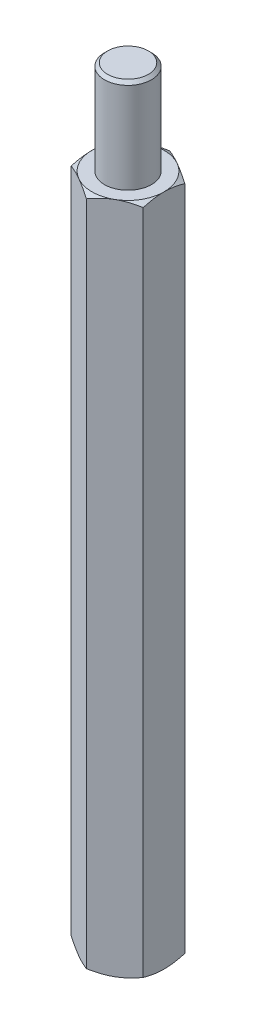
ISO-10303-21;
HEADER;
FILE_DESCRIPTION(('STEP AP214'),'2;1');
FILE_NAME('part.step','',(''),(''),'','','');
FILE_SCHEMA(('AUTOMOTIVE_DESIGN { 1 0 10303 214 1 1 1 1 }'));
ENDSEC;
DATA;
#1=APPLICATION_CONTEXT('core data for automotive mechanical design processes');
#2=APPLICATION_PROTOCOL_DEFINITION('international standard','automotive_design',2000,#1);
#3=PRODUCT_CONTEXT('',#1,'mechanical');
#4=PRODUCT('Part','Part','',(#3));
#5=PRODUCT_RELATED_PRODUCT_CATEGORY('part','',(#4));
#6=PRODUCT_DEFINITION_FORMATION('','',#4);
#7=PRODUCT_DEFINITION_CONTEXT('part definition',#1,'design');
#8=PRODUCT_DEFINITION('design','',#6,#7);
#9=PRODUCT_DEFINITION_SHAPE('','',#8);
#10=(LENGTH_UNIT() NAMED_UNIT(*) SI_UNIT(.MILLI.,.METRE.));
#11=(NAMED_UNIT(*) PLANE_ANGLE_UNIT() SI_UNIT($,.RADIAN.));
#12=(NAMED_UNIT(*) SI_UNIT($,.STERADIAN.) SOLID_ANGLE_UNIT());
#13=UNCERTAINTY_MEASURE_WITH_UNIT(LENGTH_MEASURE(1.E-05),#10,'distance_accuracy_value','');
#14=(GEOMETRIC_REPRESENTATION_CONTEXT(3) GLOBAL_UNCERTAINTY_ASSIGNED_CONTEXT((#13)) GLOBAL_UNIT_ASSIGNED_CONTEXT((#10,
#11,#12)) REPRESENTATION_CONTEXT('',''));
#15=CARTESIAN_POINT('',(0.,0.,0.));
#16=DIRECTION('',(0.,0.,1.));
#17=DIRECTION('',(1.,0.,0.));
#18=AXIS2_PLACEMENT_3D('',#15,#16,#17);
#19=CARTESIAN_POINT('',(2.3,43.,-1.32790561913614));
#20=DIRECTION('',(-0.5,0.,0.866025403784439));
#21=DIRECTION('',(0.866025403784439,0.,0.5));
#22=AXIS2_PLACEMENT_3D('',#19,#20,#21);
#23=PLANE('',#22);
#24=CARTESIAN_POINT('',(2.3002,42.7945056147885,-1.3277901490823));
#25=CARTESIAN_POINT('',(2.19912555400197,42.828211213548,-1.38614550768746));
#26=CARTESIAN_POINT('',(2.09717864227825,42.8588655278825,-1.4450045846142));
#27=CARTESIAN_POINT('',(1.89151940113185,42.9123736323119,-1.5637420028514));
#28=CARTESIAN_POINT('',(1.78780341669388,42.9352084920134,-1.62362245438593));
#29=CARTESIAN_POINT('',(1.58165684938662,42.9707552235812,-1.7426412305133));
#30=CARTESIAN_POINT('',(1.47925798966799,42.983703661704,-1.80176123973656));
#31=CARTESIAN_POINT('',(1.27397830442753,42.9991630436033,-1.9202795212693));
#32=CARTESIAN_POINT('',(1.1710982253342,43.0016867873477,-1.97967736262809));
#33=CARTESIAN_POINT('',(0.978851473271728,42.9964441482942,-2.09067107668218));
#34=CARTESIAN_POINT('',(0.889456061378301,42.9899650135142,-2.14228354180317));
#35=CARTESIAN_POINT('',(0.711247664372841,42.9694275904235,-2.24517220778613));
#36=CARTESIAN_POINT('',(0.62243529591912,42.9553622825272,-2.29644805262025));
#37=CARTESIAN_POINT('',(0.443859292371854,42.9201991689513,-2.39954895633907));
#38=CARTESIAN_POINT('',(0.354118265696694,42.8989522675106,-2.45136096224733));
#39=CARTESIAN_POINT('',(0.175974888883615,42.8507297987985,-2.55421208880471));
#40=CARTESIAN_POINT('',(0.0875702554224715,42.8237655664698,-2.60525252773111));
#41=CARTESIAN_POINT('',(-0.000199999999999056,42.7945056147885,-2.65592670832612));
#42=B_SPLINE_CURVE_WITH_KNOTS('',3,(#24,#25,#26,#27,#28,#29,#30,#31,#32,#33,#34,#35,#36,#37,#38,
#39,#40,#41),.UNSPECIFIED.,.F.,.F.,(4,2,2,2,2,2,2,2,4),(0.,0.364584226283968,0.73004494860631,
1.0864601081388,1.44243751276225,1.75242663990078,2.06270309738319,2.37986315330337,
2.69640020388921),.UNSPECIFIED.);
#43=CARTESIAN_POINT('',(2.3,42.7945722858029,-1.32790561913632));
#44=VERTEX_POINT('',#43);
#45=CARTESIAN_POINT('',(1.15,43.,-1.99185842870421));
#46=VERTEX_POINT('',#45);
#47=EDGE_CURVE('E142',#44,#46,#42,.T.);
#48=ORIENTED_EDGE('',*,*,#47,.F.);
#49=DIRECTION('',(0.,-1.,0.));
#50=VECTOR('',#49,1.);
#51=CARTESIAN_POINT('',(2.3,43.,-1.32790561913614));
#52=LINE('',#51,#50);
#53=CARTESIAN_POINT('',(2.3,0.205427714197194,-1.32790561913614));
#54=VERTEX_POINT('',#53);
#55=EDGE_CURVE('E257',#44,#54,#52,.T.);
#56=ORIENTED_EDGE('',*,*,#55,.T.);
#57=CARTESIAN_POINT('',(-0.000199999999999611,0.205494385211497,-2.65592670832612));
#58=CARTESIAN_POINT('',(0.100874445998028,0.171788786451985,-2.59757134972096));
#59=CARTESIAN_POINT('',(0.202821357721751,0.141134472117537,-2.53871227279422));
#60=CARTESIAN_POINT('',(0.408480598868145,0.0876263676881477,-2.41997485455702));
#61=CARTESIAN_POINT('',(0.512196583306119,0.0647915079865531,-2.36009440302248));
#62=CARTESIAN_POINT('',(0.718343150613384,0.0292447764187745,-2.24107562689512));
#63=CARTESIAN_POINT('',(0.820742010332007,0.0162963382959825,-2.18195561767186));
#64=CARTESIAN_POINT('',(1.02602169557247,0.000836956396655829,-2.06343733613912));
#65=CARTESIAN_POINT('',(1.1289017746658,-0.00168678734766471,-2.00403949478033));
#66=CARTESIAN_POINT('',(1.32114852672827,0.00355585170579882,-1.89304578072623));
#67=CARTESIAN_POINT('',(1.4105439386217,0.0100349864857818,-1.84143331560524));
#68=CARTESIAN_POINT('',(1.58875233562716,0.0305724095764838,-1.73854464962229));
#69=CARTESIAN_POINT('',(1.67756470408088,0.0446377174728141,-1.68726880478817));
#70=CARTESIAN_POINT('',(1.85614070762815,0.079800831048673,-1.58416790106935));
#71=CARTESIAN_POINT('',(1.94588173430331,0.101047732489425,-1.53235589516109));
#72=CARTESIAN_POINT('',(2.12402511111639,0.149270201201458,-1.42950476860371));
#73=CARTESIAN_POINT('',(2.21242974457753,0.176234433530212,-1.37846432967731));
#74=CARTESIAN_POINT('',(2.3002,0.205494385211497,-1.3277901490823));
#75=B_SPLINE_CURVE_WITH_KNOTS('',3,(#57,#58,#59,#60,#61,#62,#63,#64,#65,#66,#67,#68,#69,#70,#71,
#72,#73,#74),.UNSPECIFIED.,.F.,.F.,(4,2,2,2,2,2,2,2,4),(0.,0.364584226283967,0.730044948606311,
1.0864601081388,1.44243751276225,1.75242663990078,2.06270309738319,2.37986315330337,
2.69640020388921),.UNSPECIFIED.);
#76=CARTESIAN_POINT('',(1.15,0.,-1.99185842870421));
#77=VERTEX_POINT('',#76);
#78=EDGE_CURVE('E347',#77,#54,#75,.T.);
#79=ORIENTED_EDGE('',*,*,#78,.F.);
#80=CARTESIAN_POINT('',(0.,0.205427714197194,-2.65581123827228));
#81=VERTEX_POINT('',#80);
#82=EDGE_CURVE('E343',#81,#77,#75,.T.);
#83=ORIENTED_EDGE('',*,*,#82,.F.);
#84=DIRECTION('',(0.,-1.,0.));
#85=VECTOR('',#84,1.);
#86=CARTESIAN_POINT('',(0.,43.,-2.65581123827228));
#87=LINE('',#86,#85);
#88=CARTESIAN_POINT('',(0.,42.7945722858028,-2.65581123827228));
#89=VERTEX_POINT('',#88);
#90=EDGE_CURVE('E169',#89,#81,#87,.T.);
#91=ORIENTED_EDGE('',*,*,#90,.F.);
#92=EDGE_CURVE('E152',#46,#89,#42,.T.);
#93=ORIENTED_EDGE('',*,*,#92,.F.);
#94=EDGE_LOOP('',(#48,#56,#79,#83,#91,#93));
#95=FACE_BOUND('',#94,.T.);
#96=ADVANCED_FACE('F53',(#95),#23,.F.);
#97=CARTESIAN_POINT('',(0.,43.,-2.65581123827228));
#98=DIRECTION('',(0.5,0.,0.866025403784439));
#99=DIRECTION('',(0.866025403784439,0.,-0.5));
#100=AXIS2_PLACEMENT_3D('',#97,#98,#99);
#101=PLANE('',#100);
#102=CARTESIAN_POINT('',(0.000199999999999922,42.7945056147885,-2.65592670832612));
#103=CARTESIAN_POINT('',(-0.100874445998028,42.828211213548,-2.59757134972096));
#104=CARTESIAN_POINT('',(-0.202821357721751,42.8588655278825,-2.53871227279422));
#105=CARTESIAN_POINT('',(-0.408480598868145,42.9123736323119,-2.41997485455702));
#106=CARTESIAN_POINT('',(-0.512196583306119,42.9352084920134,-2.36009440302248));
#107=CARTESIAN_POINT('',(-0.718343150613383,42.9707552235812,-2.24107562689512));
#108=CARTESIAN_POINT('',(-0.820742010332006,42.983703661704,-2.18195561767186));
#109=CARTESIAN_POINT('',(-1.02602169557247,42.9991630436033,-2.06343733613912));
#110=CARTESIAN_POINT('',(-1.1289017746658,43.0016867873477,-2.00403949478033));
#111=CARTESIAN_POINT('',(-1.32114852672827,42.9964441482942,-1.89304578072623));
#112=CARTESIAN_POINT('',(-1.4105439386217,42.9899650135142,-1.84143331560525));
#113=CARTESIAN_POINT('',(-1.58875233562716,42.9694275904235,-1.73854464962229));
#114=CARTESIAN_POINT('',(-1.67756470408088,42.9553622825272,-1.68726880478817));
#115=CARTESIAN_POINT('',(-1.85614070762815,42.9201991689513,-1.58416790106935));
#116=CARTESIAN_POINT('',(-1.94588173430331,42.8989522675106,-1.53235589516109));
#117=CARTESIAN_POINT('',(-2.12402511111639,42.8507297987985,-1.42950476860371));
#118=CARTESIAN_POINT('',(-2.21242974457753,42.8237655664698,-1.37846432967731));
#119=CARTESIAN_POINT('',(-2.3002,42.7945056147885,-1.3277901490823));
#120=B_SPLINE_CURVE_WITH_KNOTS('',3,(#102,#103,#104,#105,#106,#107,#108,#109,#110,#111,#112,
#113,#114,#115,#116,#117,#118,#119),.UNSPECIFIED.,.F.,.F.,(4,2,2,2,2,2,2,2,4),(0.,
0.364584226283968,0.73004494860631,1.0864601081388,1.44243751276225,1.75242663990078,
2.06270309738319,2.37986315330337,2.69640020388921),.UNSPECIFIED.);
#121=CARTESIAN_POINT('',(-1.15,43.,-1.99185842870421));
#122=VERTEX_POINT('',#121);
#123=EDGE_CURVE('E159',#89,#122,#120,.T.);
#124=ORIENTED_EDGE('',*,*,#123,.F.);
#125=ORIENTED_EDGE('',*,*,#90,.T.);
#126=CARTESIAN_POINT('',(-2.3002,0.205494385211497,-1.3277901490823));
#127=CARTESIAN_POINT('',(-2.19912555400197,0.171788786451985,-1.38614550768746));
#128=CARTESIAN_POINT('',(-2.09717864227825,0.141134472117537,-1.4450045846142));
#129=CARTESIAN_POINT('',(-1.89151940113186,0.0876263676881478,-1.5637420028514));
#130=CARTESIAN_POINT('',(-1.78780341669388,0.0647915079865532,-1.62362245438593));
#131=CARTESIAN_POINT('',(-1.58165684938662,0.0292447764187746,-1.7426412305133));
#132=CARTESIAN_POINT('',(-1.47925798966799,0.0162963382959825,-1.80176123973656));
#133=CARTESIAN_POINT('',(-1.27397830442753,0.000836956396655778,-1.9202795212693));
#134=CARTESIAN_POINT('',(-1.1710982253342,-0.00168678734766485,-1.97967736262809));
#135=CARTESIAN_POINT('',(-0.978851473271727,0.00355585170579847,-2.09067107668219));
#136=CARTESIAN_POINT('',(-0.889456061378299,0.0100349864857813,-2.14228354180317));
#137=CARTESIAN_POINT('',(-0.711247664372838,0.0305724095764833,-2.24517220778613));
#138=CARTESIAN_POINT('',(-0.622435295919117,0.0446377174728137,-2.29644805262025));
#139=CARTESIAN_POINT('',(-0.443859292371852,0.0798008310486727,-2.39954895633907));
#140=CARTESIAN_POINT('',(-0.354118265696691,0.101047732489425,-2.45136096224733));
#141=CARTESIAN_POINT('',(-0.175974888883613,0.149270201201458,-2.55421208880471));
#142=CARTESIAN_POINT('',(-0.0875702554224698,0.176234433530212,-2.60525252773111));
#143=CARTESIAN_POINT('',(0.000200000000000366,0.205494385211497,-2.65592670832612));
#144=B_SPLINE_CURVE_WITH_KNOTS('',3,(#126,#127,#128,#129,#130,#131,#132,#133,#134,#135,#136,
#137,#138,#139,#140,#141,#142,#143),.UNSPECIFIED.,.F.,.F.,(4,2,2,2,2,2,2,2,4),(0.,
0.364584226283966,0.730044948606311,1.0864601081388,1.44243751276225,1.75242663990078,
2.06270309738319,2.37986315330337,2.69640020388921),.UNSPECIFIED.);
#145=CARTESIAN_POINT('',(-1.15,0.,-1.99185842870421));
#146=VERTEX_POINT('',#145);
#147=EDGE_CURVE('E248',#146,#81,#144,.T.);
#148=ORIENTED_EDGE('',*,*,#147,.F.);
#149=CARTESIAN_POINT('',(-2.3,0.205427714197194,-1.32790561913614));
#150=VERTEX_POINT('',#149);
#151=EDGE_CURVE('E332',#150,#146,#144,.T.);
#152=ORIENTED_EDGE('',*,*,#151,.F.);
#153=DIRECTION('',(0.,-1.,0.));
#154=VECTOR('',#153,1.);
#155=CARTESIAN_POINT('',(-2.3,43.,-1.32790561913614));
#156=LINE('',#155,#154);
#157=CARTESIAN_POINT('',(-2.3,42.7945722858028,-1.32790561913614));
#158=VERTEX_POINT('',#157);
#159=EDGE_CURVE('E269',#158,#150,#156,.T.);
#160=ORIENTED_EDGE('',*,*,#159,.F.);
#161=EDGE_CURVE('E170',#122,#158,#120,.T.);
#162=ORIENTED_EDGE('',*,*,#161,.F.);
#163=EDGE_LOOP('',(#124,#125,#148,#152,#160,#162));
#164=FACE_BOUND('',#163,.T.);
#165=ADVANCED_FACE('F232',(#164),#101,.F.);
#166=CARTESIAN_POINT('',(-2.3,43.,-1.32790561913614));
#167=DIRECTION('',(1.,0.,0.));
#168=DIRECTION('',(0.,0.,-1.));
#169=AXIS2_PLACEMENT_3D('',#166,#167,#168);
#170=PLANE('',#169);
#171=CARTESIAN_POINT('',(-2.3,40.9738167629916,-5.33476673948727));
#172=CARTESIAN_POINT('',(-2.3,41.0380904472929,-5.213522867162));
#173=CARTESIAN_POINT('',(-2.3,41.1021066485562,-5.09214157130182));
#174=CARTESIAN_POINT('',(-2.3,41.229490548368,-4.84903792227373));
#175=CARTESIAN_POINT('',(-2.3,41.2928582410594,-4.72731556603804));
#176=CARTESIAN_POINT('',(-2.3,41.4188841115838,-4.48332310557624));
#177=CARTESIAN_POINT('',(-2.3,41.4815413724409,-4.3610525270802));
#178=CARTESIAN_POINT('',(-2.3,41.6058857732664,-4.11601679003399));
#179=CARTESIAN_POINT('',(-2.3,41.6675729025973,-3.99325162607924));
#180=CARTESIAN_POINT('',(-2.3,41.7930559417178,-3.7404261875195));
#181=CARTESIAN_POINT('',(-2.3,41.8567841225145,-3.61033222329895));
#182=CARTESIAN_POINT('',(-2.3,41.9825064041342,-3.34930967097839));
#183=CARTESIAN_POINT('',(-2.3,42.0445005361599,-3.21838109794855));
#184=CARTESIAN_POINT('',(-2.3,42.166197055359,-2.9555241485078));
#185=CARTESIAN_POINT('',(-2.3,42.2259003752237,-2.82359620575359));
#186=CARTESIAN_POINT('',(-2.3,42.3422838108303,-2.55841872868751));
#187=CARTESIAN_POINT('',(-2.3,42.3989641589018,-2.42516929687449));
#188=CARTESIAN_POINT('',(-2.3,42.5129154472536,-2.14551362192698));
#189=CARTESIAN_POINT('',(-2.3,42.5698218483553,-1.9989572856013));
#190=CARTESIAN_POINT('',(-2.3,42.676813845049,-1.70339786927657));
#191=CARTESIAN_POINT('',(-2.3,42.7269020093169,-1.55439573453712));
#192=CARTESIAN_POINT('',(-2.3,42.8165640787229,-1.2563129735238));
#193=CARTESIAN_POINT('',(-2.3,42.8563213746131,-1.10728876992975));
#194=CARTESIAN_POINT('',(-2.3,42.9230272167531,-0.80637582900001));
#195=CARTESIAN_POINT('',(-2.3,42.949983259499,-0.654488822460735));
#196=CARTESIAN_POINT('',(-2.3,42.9845788604133,-0.373214208776499));
#197=CARTESIAN_POINT('',(-2.3,42.994625100911,-0.244130019358298));
#198=CARTESIAN_POINT('',(-2.3,43.0020643474704,0.0143777764011417));
#199=CARTESIAN_POINT('',(-2.3,42.999461146626,0.143801269364731));
#200=CARTESIAN_POINT('',(-2.3,42.9817645175082,0.40413144986264));
#201=CARTESIAN_POINT('',(-2.3,42.9664454761507,0.535022481195092));
#202=CARTESIAN_POINT('',(-2.3,42.935192831315,0.729983569434606));
#203=CARTESIAN_POINT('',(-2.3,42.923392130681,0.794757992445278));
#204=CARTESIAN_POINT('',(-2.3,42.8973142415894,0.923805013327416));
#205=CARTESIAN_POINT('',(-2.3,42.8830371519365,0.988077631113393));
#206=CARTESIAN_POINT('',(-2.3,42.8205259759377,1.24841354131159));
#207=CARTESIAN_POINT('',(-2.3,42.7631029495,1.44227628624717));
#208=CARTESIAN_POINT('',(-2.3,42.6349495743438,1.82559392516044));
#209=CARTESIAN_POINT('',(-2.3,42.5642024854492,2.01504293361416));
#210=CARTESIAN_POINT('',(-2.3,42.4138477522046,2.39151782246775));
#211=CARTESIAN_POINT('',(-2.3,42.3341951002606,2.57852552012131));
#212=CARTESIAN_POINT('',(-2.3,42.1693527072298,2.94993492013859));
#213=CARTESIAN_POINT('',(-2.3,42.0841658810996,3.1343379331157));
#214=CARTESIAN_POINT('',(-2.3,41.9158161768716,3.48912718118699));
#215=CARTESIAN_POINT('',(-2.3,41.8328961109316,3.65962927920734));
#216=CARTESIAN_POINT('',(-2.3,41.6646839259556,3.99948603380781));
#217=CARTESIAN_POINT('',(-2.3,41.579391464736,4.16884052043465));
#218=CARTESIAN_POINT('',(-2.3,41.4080873498753,4.50468112737691));
#219=CARTESIAN_POINT('',(-2.3,41.322095894913,4.67117758071065));
#220=CARTESIAN_POINT('',(-2.3,41.1488280243447,5.00345386021996));
#221=CARTESIAN_POINT('',(-2.3,41.061551900046,5.16923383815899));
#222=CARTESIAN_POINT('',(-2.3,40.9738167629916,5.33476673948727));
#223=B_SPLINE_CURVE_WITH_KNOTS('',3,(#171,#172,#173,#174,#175,#176,#177,#178,#179,#180,#181,
#182,#183,#184,#185,#186,#187,#188,#189,#190,#191,#192,#193,#194,#195,#196,#197,#198,#199,#200,
#201,#202,#203,#204,#205,#206,#207,#208,#209,#210,#211,#212,#213,#214,#215,#216,#217,#218,#219,
#220,#221,#222),.UNSPECIFIED.,.F.,.F.,(4,2,2,2,2,2,2,2,2,2,2,2,2,2,2,2,2,2,2,2,2,2,2,2,2,4),(0.,
0.411681184132733,0.823366083229136,1.23553270142344,1.64770383584565,2.08228742603518,
2.51686319123402,2.9512601021455,3.38562357935276,3.85715791843588,4.32851411895539,
4.79082129667843,5.25285740947305,5.64070288240156,6.02843206216973,6.42319142647402,
6.62067366808274,6.81814803221405,7.42381343764696,8.03024493173326,8.63989305020558,
9.24922261865601,9.81798680092645,10.3868334489986,10.9490018991671,11.5110447798201),.UNSPECIFIED.);
#224=CARTESIAN_POINT('',(-2.3,43.,0.));
#225=VERTEX_POINT('',#224);
#226=EDGE_CURVE('E226',#158,#225,#223,.T.);
#227=ORIENTED_EDGE('',*,*,#226,.F.);
#228=ORIENTED_EDGE('',*,*,#159,.T.);
#229=CARTESIAN_POINT('',(-2.3,2.02618323700842,5.33476673948726));
#230=CARTESIAN_POINT('',(-2.3,1.9619095527071,5.213522867162));
#231=CARTESIAN_POINT('',(-2.3,1.89789335144379,5.09214157130182));
#232=CARTESIAN_POINT('',(-2.3,1.77050945163195,4.84903792227373));
#233=CARTESIAN_POINT('',(-2.3,1.70714175894063,4.72731556603804));
#234=CARTESIAN_POINT('',(-2.3,1.58111588841625,4.48332310557624));
#235=CARTESIAN_POINT('',(-2.3,1.51845862755913,4.3610525270802));
#236=CARTESIAN_POINT('',(-2.3,1.39411422673365,4.11601679003399));
#237=CARTESIAN_POINT('',(-2.3,1.33242709740271,3.99325162607924));
#238=CARTESIAN_POINT('',(-2.3,1.2069440582822,3.7404261875195));
#239=CARTESIAN_POINT('',(-2.3,1.14321587748546,3.61033222329895));
#240=CARTESIAN_POINT('',(-2.3,1.01749359586577,3.34930967097839));
#241=CARTESIAN_POINT('',(-2.3,0.955499463840116,3.21838109794854));
#242=CARTESIAN_POINT('',(-2.3,0.833802944641018,2.9555241485078));
#243=CARTESIAN_POINT('',(-2.3,0.774099624776258,2.82359620575359));
#244=CARTESIAN_POINT('',(-2.3,0.657716189169664,2.55841872868751));
#245=CARTESIAN_POINT('',(-2.3,0.601035841098183,2.42516929687448));
#246=CARTESIAN_POINT('',(-2.3,0.487084552746361,2.14551362192697));
#247=CARTESIAN_POINT('',(-2.3,0.430178151644698,1.9989572856013));
#248=CARTESIAN_POINT('',(-2.3,0.323186154950946,1.70339786927657));
#249=CARTESIAN_POINT('',(-2.3,0.273097990683144,1.55439573453711));
#250=CARTESIAN_POINT('',(-2.3,0.183435921277132,1.2563129735238));
#251=CARTESIAN_POINT('',(-2.3,0.143678625386842,1.10728876992974));
#252=CARTESIAN_POINT('',(-2.3,0.0769727832468804,0.806375829000007));
#253=CARTESIAN_POINT('',(-2.3,0.0500167405009475,0.654488822460732));
#254=CARTESIAN_POINT('',(-2.3,0.015421139586715,0.373214208776496));
#255=CARTESIAN_POINT('',(-2.3,0.00537489908899122,0.244130019358295));
#256=CARTESIAN_POINT('',(-2.3,-0.00206434747041359,-0.0143777764011453));
#257=CARTESIAN_POINT('',(-2.3,0.000538853373971855,-0.143801269364735));
#258=CARTESIAN_POINT('',(-2.3,0.0182354824917902,-0.404131449862644));
#259=CARTESIAN_POINT('',(-2.3,0.0335545238492682,-0.535022481195097));
#260=CARTESIAN_POINT('',(-2.3,0.0648071686849991,-0.729983569434611));
#261=CARTESIAN_POINT('',(-2.3,0.076607869318987,-0.794757992445283));
#262=CARTESIAN_POINT('',(-2.3,0.102685758410603,-0.923805013327422));
#263=CARTESIAN_POINT('',(-2.3,0.116962848063474,-0.988077631113398));
#264=CARTESIAN_POINT('',(-2.3,0.17947402406227,-1.24841354131159));
#265=CARTESIAN_POINT('',(-2.3,0.236897050499996,-1.44227628624718));
#266=CARTESIAN_POINT('',(-2.3,0.365050425656249,-1.82559392516045));
#267=CARTESIAN_POINT('',(-2.3,0.435797514550802,-2.01504293361417));
#268=CARTESIAN_POINT('',(-2.3,0.586152247795391,-2.39151782246775));
#269=CARTESIAN_POINT('',(-2.3,0.66580489973939,-2.57852552012131));
#270=CARTESIAN_POINT('',(-2.3,0.830647292770178,-2.94993492013859));
#271=CARTESIAN_POINT('',(-2.3,0.915834118900354,-3.1343379331157));
#272=CARTESIAN_POINT('',(-2.3,1.08418382312836,-3.48912718118699));
#273=CARTESIAN_POINT('',(-2.3,1.16710388906838,-3.65962927920734));
#274=CARTESIAN_POINT('',(-2.3,1.33531607404435,-3.99948603380781));
#275=CARTESIAN_POINT('',(-2.3,1.42060853526395,-4.16884052043465));
#276=CARTESIAN_POINT('',(-2.3,1.59191265012469,-4.50468112737691));
#277=CARTESIAN_POINT('',(-2.3,1.67790410508701,-4.67117758071065));
#278=CARTESIAN_POINT('',(-2.3,1.85117197565531,-5.00345386021996));
#279=CARTESIAN_POINT('',(-2.3,1.93844809995398,-5.16923383815898));
#280=CARTESIAN_POINT('',(-2.3,2.02618323700842,-5.33476673948727));
#281=B_SPLINE_CURVE_WITH_KNOTS('',3,(#229,#230,#231,#232,#233,#234,#235,#236,#237,#238,#239,
#240,#241,#242,#243,#244,#245,#246,#247,#248,#249,#250,#251,#252,#253,#254,#255,#256,#257,#258,
#259,#260,#261,#262,#263,#264,#265,#266,#267,#268,#269,#270,#271,#272,#273,#274,#275,#276,#277,
#278,#279,#280),.UNSPECIFIED.,.F.,.F.,(4,2,2,2,2,2,2,2,2,2,2,2,2,2,2,2,2,2,2,2,2,2,2,2,2,4),(0.,
0.411681184132734,0.823366083229136,1.23553270142344,1.64770383584565,2.08228742603518,
2.51686319123402,2.9512601021455,3.38562357935276,3.85715791843588,4.32851411895538,
4.79082129667843,5.25285740947305,5.64070288240156,6.02843206216973,6.42319142647402,
6.62067366808274,6.81814803221405,7.42381343764696,8.03024493173326,8.63989305020558,
9.249222618656,9.81798680092644,10.3868334489986,10.9490018991671,11.5110447798201),.UNSPECIFIED.);
#282=CARTESIAN_POINT('',(-2.3,0.,0.));
#283=VERTEX_POINT('',#282);
#284=EDGE_CURVE('E238',#283,#150,#281,.T.);
#285=ORIENTED_EDGE('',*,*,#284,.F.);
#286=CARTESIAN_POINT('',(-2.3,0.205427714197193,1.32790561913614));
#287=VERTEX_POINT('',#286);
#288=EDGE_CURVE('E246',#287,#283,#281,.T.);
#289=ORIENTED_EDGE('',*,*,#288,.F.);
#290=DIRECTION('',(0.,-1.,0.));
#291=VECTOR('',#290,1.);
#292=CARTESIAN_POINT('',(-2.3,43.,1.32790561913614));
#293=LINE('',#292,#291);
#294=CARTESIAN_POINT('',(-2.3,42.7945722858028,1.32790561913614));
#295=VERTEX_POINT('',#294);
#296=EDGE_CURVE('E267',#295,#287,#293,.T.);
#297=ORIENTED_EDGE('',*,*,#296,.F.);
#298=EDGE_CURVE('E220',#225,#295,#223,.T.);
#299=ORIENTED_EDGE('',*,*,#298,.F.);
#300=EDGE_LOOP('',(#227,#228,#285,#289,#297,#299));
#301=FACE_BOUND('',#300,.T.);
#302=ADVANCED_FACE('F228',(#301),#170,.F.);
#303=CARTESIAN_POINT('',(-2.3,43.,1.32790561913614));
#304=DIRECTION('',(0.5,0.,-0.866025403784439));
#305=DIRECTION('',(-0.866025403784439,0.,-0.5));
#306=AXIS2_PLACEMENT_3D('',#303,#304,#305);
#307=PLANE('',#306);
#308=CARTESIAN_POINT('',(-2.3002,42.7945056147885,1.3277901490823));
#309=CARTESIAN_POINT('',(-2.19912555400197,42.828211213548,1.38614550768746));
#310=CARTESIAN_POINT('',(-2.09717864227825,42.8588655278825,1.4450045846142));
#311=CARTESIAN_POINT('',(-1.89151940113185,42.9123736323119,1.5637420028514));
#312=CARTESIAN_POINT('',(-1.78780341669388,42.9352084920134,1.62362245438593));
#313=CARTESIAN_POINT('',(-1.58165684938662,42.9707552235812,1.7426412305133));
#314=CARTESIAN_POINT('',(-1.47925798966799,42.983703661704,1.80176123973656));
#315=CARTESIAN_POINT('',(-1.27397830442753,42.9991630436033,1.9202795212693));
#316=CARTESIAN_POINT('',(-1.1710982253342,43.0016867873477,1.97967736262809));
#317=CARTESIAN_POINT('',(-0.978851473271728,42.9964441482942,2.09067107668218));
#318=CARTESIAN_POINT('',(-0.889456061378301,42.9899650135142,2.14228354180317));
#319=CARTESIAN_POINT('',(-0.71124766437284,42.9694275904235,2.24517220778613));
#320=CARTESIAN_POINT('',(-0.622435295919119,42.9553622825272,2.29644805262025));
#321=CARTESIAN_POINT('',(-0.443859292371854,42.9201991689513,2.39954895633907));
#322=CARTESIAN_POINT('',(-0.354118265696694,42.8989522675106,2.45136096224733));
#323=CARTESIAN_POINT('',(-0.175974888883615,42.8507297987985,2.55421208880471));
#324=CARTESIAN_POINT('',(-0.0875702554224715,42.8237655664698,2.60525252773111));
#325=CARTESIAN_POINT('',(0.000199999999998942,42.7945056147885,2.65592670832612));
#326=B_SPLINE_CURVE_WITH_KNOTS('',3,(#308,#309,#310,#311,#312,#313,#314,#315,#316,#317,#318,
#319,#320,#321,#322,#323,#324,#325),.UNSPECIFIED.,.F.,.F.,(4,2,2,2,2,2,2,2,4),(0.,
0.364584226283968,0.73004494860631,1.0864601081388,1.44243751276225,1.75242663990078,
2.06270309738319,2.37986315330337,2.6964002038892),.UNSPECIFIED.);
#327=CARTESIAN_POINT('',(-1.15,43.,1.99185842870421));
#328=VERTEX_POINT('',#327);
#329=EDGE_CURVE('E227',#295,#328,#326,.T.);
#330=ORIENTED_EDGE('',*,*,#329,.F.);
#331=ORIENTED_EDGE('',*,*,#296,.T.);
#332=CARTESIAN_POINT('',(0.000199999999999354,0.205494385211497,2.65592670832612));
#333=CARTESIAN_POINT('',(-0.100874445998028,0.171788786451985,2.59757134972096));
#334=CARTESIAN_POINT('',(-0.202821357721751,0.141134472117537,2.53871227279422));
#335=CARTESIAN_POINT('',(-0.408480598868146,0.0876263676881475,2.41997485455702));
#336=CARTESIAN_POINT('',(-0.512196583306119,0.0647915079865528,2.36009440302248));
#337=CARTESIAN_POINT('',(-0.718343150613384,0.0292447764187742,2.24107562689512));
#338=CARTESIAN_POINT('',(-0.820742010332007,0.0162963382959822,2.18195561767186));
#339=CARTESIAN_POINT('',(-1.02602169557247,0.000836956396655513,2.06343733613912));
#340=CARTESIAN_POINT('',(-1.1289017746658,-0.00168678734766511,2.00403949478033));
#341=CARTESIAN_POINT('',(-1.32114852672827,0.00355585170579834,1.89304578072623));
#342=CARTESIAN_POINT('',(-1.4105439386217,0.0100349864857813,1.84143331560524));
#343=CARTESIAN_POINT('',(-1.58875233562716,0.0305724095764833,1.73854464962229));
#344=CARTESIAN_POINT('',(-1.67756470408088,0.0446377174728136,1.68726880478817));
#345=CARTESIAN_POINT('',(-1.85614070762815,0.0798008310486726,1.58416790106934));
#346=CARTESIAN_POINT('',(-1.94588173430331,0.101047732489425,1.53235589516109));
#347=CARTESIAN_POINT('',(-2.12402511111639,0.149270201201458,1.42950476860371));
#348=CARTESIAN_POINT('',(-2.21242974457753,0.176234433530212,1.37846432967731));
#349=CARTESIAN_POINT('',(-2.3002,0.205494385211497,1.3277901490823));
#350=B_SPLINE_CURVE_WITH_KNOTS('',3,(#332,#333,#334,#335,#336,#337,#338,#339,#340,#341,#342,
#343,#344,#345,#346,#347,#348,#349),.UNSPECIFIED.,.F.,.F.,(4,2,2,2,2,2,2,2,4),(0.,
0.364584226283966,0.730044948606311,1.0864601081388,1.44243751276225,1.75242663990078,
2.06270309738319,2.37986315330337,2.69640020388921),.UNSPECIFIED.);
#351=CARTESIAN_POINT('',(-1.15,0.,1.99185842870421));
#352=VERTEX_POINT('',#351);
#353=EDGE_CURVE('E247',#352,#287,#350,.T.);
#354=ORIENTED_EDGE('',*,*,#353,.F.);
#355=CARTESIAN_POINT('',(0.,0.205427714197193,2.65581123827228));
#356=VERTEX_POINT('',#355);
#357=EDGE_CURVE('E333',#356,#352,#350,.T.);
#358=ORIENTED_EDGE('',*,*,#357,.F.);
#359=DIRECTION('',(0.,-1.,0.));
#360=VECTOR('',#359,1.);
#361=CARTESIAN_POINT('',(0.,43.,2.65581123827228));
#362=LINE('',#361,#360);
#363=CARTESIAN_POINT('',(0.,42.7945722858028,2.65581123827228));
#364=VERTEX_POINT('',#363);
#365=EDGE_CURVE('E265',#364,#356,#362,.T.);
#366=ORIENTED_EDGE('',*,*,#365,.F.);
#367=EDGE_CURVE('E214',#328,#364,#326,.T.);
#368=ORIENTED_EDGE('',*,*,#367,.F.);
#369=EDGE_LOOP('',(#330,#331,#354,#358,#366,#368));
#370=FACE_BOUND('',#369,.T.);
#371=ADVANCED_FACE('F231',(#370),#307,.F.);
#372=CARTESIAN_POINT('',(0.,43.,2.65581123827228));
#373=DIRECTION('',(-0.5,0.,-0.866025403784439));
#374=DIRECTION('',(-0.866025403784439,0.,0.5));
#375=AXIS2_PLACEMENT_3D('',#372,#373,#374);
#376=PLANE('',#375);
#377=CARTESIAN_POINT('',(-0.000200000000000132,42.7945056147885,2.65592670832612));
#378=CARTESIAN_POINT('',(0.100874445998028,42.828211213548,2.59757134972096));
#379=CARTESIAN_POINT('',(0.202821357721751,42.8588655278825,2.53871227279422));
#380=CARTESIAN_POINT('',(0.408480598868145,42.9123736323119,2.41997485455702));
#381=CARTESIAN_POINT('',(0.512196583306118,42.9352084920134,2.36009440302248));
#382=CARTESIAN_POINT('',(0.718343150613382,42.9707552235812,2.24107562689512));
#383=CARTESIAN_POINT('',(0.820742010332006,42.983703661704,2.18195561767186));
#384=CARTESIAN_POINT('',(1.02602169557247,42.9991630436033,2.06343733613912));
#385=CARTESIAN_POINT('',(1.1289017746658,43.0016867873477,2.00403949478033));
#386=CARTESIAN_POINT('',(1.32114852672827,42.9964441482942,1.89304578072623));
#387=CARTESIAN_POINT('',(1.4105439386217,42.9899650135142,1.84143331560525));
#388=CARTESIAN_POINT('',(1.58875233562716,42.9694275904235,1.73854464962229));
#389=CARTESIAN_POINT('',(1.67756470408088,42.9553622825272,1.68726880478817));
#390=CARTESIAN_POINT('',(1.85614070762815,42.9201991689513,1.58416790106935));
#391=CARTESIAN_POINT('',(1.94588173430331,42.8989522675106,1.53235589516109));
#392=CARTESIAN_POINT('',(2.12402511111639,42.8507297987985,1.42950476860371));
#393=CARTESIAN_POINT('',(2.21242974457753,42.8237655664698,1.37846432967731));
#394=CARTESIAN_POINT('',(2.3002,42.7945056147885,1.3277901490823));
#395=B_SPLINE_CURVE_WITH_KNOTS('',3,(#377,#378,#379,#380,#381,#382,#383,#384,#385,#386,#387,
#388,#389,#390,#391,#392,#393,#394),.UNSPECIFIED.,.F.,.F.,(4,2,2,2,2,2,2,2,4),(0.,
0.364584226283968,0.73004494860631,1.0864601081388,1.44243751276225,1.75242663990078,
2.06270309738319,2.37986315330337,2.6964002038892),.UNSPECIFIED.);
#396=CARTESIAN_POINT('',(1.15,43.,1.99185842870421));
#397=VERTEX_POINT('',#396);
#398=EDGE_CURVE('E386',#364,#397,#395,.T.);
#399=ORIENTED_EDGE('',*,*,#398,.F.);
#400=ORIENTED_EDGE('',*,*,#365,.T.);
#401=CARTESIAN_POINT('',(2.3002,0.205494385211497,1.3277901490823));
#402=CARTESIAN_POINT('',(2.19912555400197,0.171788786451985,1.38614550768746));
#403=CARTESIAN_POINT('',(2.09717864227825,0.141134472117537,1.4450045846142));
#404=CARTESIAN_POINT('',(1.89151940113185,0.0876263676881474,1.5637420028514));
#405=CARTESIAN_POINT('',(1.78780341669388,0.0647915079865528,1.62362245438593));
#406=CARTESIAN_POINT('',(1.58165684938662,0.0292447764187743,1.7426412305133));
#407=CARTESIAN_POINT('',(1.47925798966799,0.0162963382959823,1.80176123973656));
#408=CARTESIAN_POINT('',(1.27397830442753,0.000836956396655658,1.9202795212693));
#409=CARTESIAN_POINT('',(1.1710982253342,-0.00168678734766488,1.97967736262809));
#410=CARTESIAN_POINT('',(0.978851473271726,0.00355585170579849,2.09067107668219));
#411=CARTESIAN_POINT('',(0.889456061378299,0.0100349864857813,2.14228354180317));
#412=CARTESIAN_POINT('',(0.711247664372838,0.0305724095764833,2.24517220778613));
#413=CARTESIAN_POINT('',(0.622435295919117,0.0446377174728137,2.29644805262025));
#414=CARTESIAN_POINT('',(0.443859292371851,0.0798008310486726,2.39954895633907));
#415=CARTESIAN_POINT('',(0.354118265696691,0.101047732489425,2.45136096224733));
#416=CARTESIAN_POINT('',(0.175974888883613,0.149270201201458,2.55421208880471));
#417=CARTESIAN_POINT('',(0.0875702554224694,0.176234433530212,2.60525252773111));
#418=CARTESIAN_POINT('',(-0.00020000000000067,0.205494385211497,2.65592670832612));
#419=B_SPLINE_CURVE_WITH_KNOTS('',3,(#401,#402,#403,#404,#405,#406,#407,#408,#409,#410,#411,
#412,#413,#414,#415,#416,#417,#418),.UNSPECIFIED.,.F.,.F.,(4,2,2,2,2,2,2,2,4),(0.,
0.364584226283966,0.730044948606311,1.0864601081388,1.44243751276225,1.75242663990078,
2.06270309738319,2.37986315330337,2.69640020388921),.UNSPECIFIED.);
#420=CARTESIAN_POINT('',(1.15,0.,1.99185842870421));
#421=VERTEX_POINT('',#420);
#422=EDGE_CURVE('E339',#421,#356,#419,.T.);
#423=ORIENTED_EDGE('',*,*,#422,.F.);
#424=CARTESIAN_POINT('',(2.3,0.205427714197071,1.32790561913632));
#425=VERTEX_POINT('',#424);
#426=EDGE_CURVE('E345',#425,#421,#419,.T.);
#427=ORIENTED_EDGE('',*,*,#426,.F.);
#428=DIRECTION('',(0.,-1.,0.));
#429=VECTOR('',#428,1.);
#430=CARTESIAN_POINT('',(2.3,43.,1.32790561913614));
#431=LINE('',#430,#429);
#432=CARTESIAN_POINT('',(2.3,42.7945722858028,1.32790561913614));
#433=VERTEX_POINT('',#432);
#434=EDGE_CURVE('E263',#433,#425,#431,.T.);
#435=ORIENTED_EDGE('',*,*,#434,.F.);
#436=EDGE_CURVE('E206',#397,#433,#395,.T.);
#437=ORIENTED_EDGE('',*,*,#436,.F.);
#438=EDGE_LOOP('',(#399,#400,#423,#427,#435,#437));
#439=FACE_BOUND('',#438,.T.);
#440=ADVANCED_FACE('F373',(#439),#376,.F.);
#441=CARTESIAN_POINT('',(2.3,43.,1.32790561913614));
#442=DIRECTION('',(-1.,0.,0.));
#443=DIRECTION('',(0.,0.,1.));
#444=AXIS2_PLACEMENT_3D('',#441,#442,#443);
#445=PLANE('',#444);
#446=CARTESIAN_POINT('',(2.3,40.9738167629916,5.33476673948727));
#447=CARTESIAN_POINT('',(2.3,41.0380904472929,5.21352286716201));
#448=CARTESIAN_POINT('',(2.3,41.1021066485562,5.09214157130182));
#449=CARTESIAN_POINT('',(2.3,41.229490548368,4.84903792227373));
#450=CARTESIAN_POINT('',(2.3,41.2928582410594,4.72731556603804));
#451=CARTESIAN_POINT('',(2.3,41.4188841115838,4.48332310557624));
#452=CARTESIAN_POINT('',(2.3,41.4815413724409,4.3610525270802));
#453=CARTESIAN_POINT('',(2.3,41.6058857732664,4.11601679003399));
#454=CARTESIAN_POINT('',(2.3,41.6675729025973,3.99325162607924));
#455=CARTESIAN_POINT('',(2.3,41.7930559417178,3.7404261875195));
#456=CARTESIAN_POINT('',(2.3,41.8567841225145,3.61033222329895));
#457=CARTESIAN_POINT('',(2.3,41.9825064041342,3.34930967097839));
#458=CARTESIAN_POINT('',(2.3,42.0445005361599,3.21838109794855));
#459=CARTESIAN_POINT('',(2.3,42.166197055359,2.9555241485078));
#460=CARTESIAN_POINT('',(2.3,42.2259003752237,2.82359620575359));
#461=CARTESIAN_POINT('',(2.3,42.3422838108303,2.55841872868751));
#462=CARTESIAN_POINT('',(2.3,42.3989641589018,2.42516929687449));
#463=CARTESIAN_POINT('',(2.3,42.5129154472536,2.14551362192698));
#464=CARTESIAN_POINT('',(2.3,42.5698218483553,1.9989572856013));
#465=CARTESIAN_POINT('',(2.3,42.676813845049,1.70339786927657));
#466=CARTESIAN_POINT('',(2.3,42.7269020093169,1.55439573453712));
#467=CARTESIAN_POINT('',(2.3,42.8165640787229,1.2563129735238));
#468=CARTESIAN_POINT('',(2.3,42.8563213746131,1.10728876992975));
#469=CARTESIAN_POINT('',(2.3,42.9230272167531,0.80637582900001));
#470=CARTESIAN_POINT('',(2.3,42.949983259499,0.654488822460736));
#471=CARTESIAN_POINT('',(2.3,42.9845788604133,0.3732142087765));
#472=CARTESIAN_POINT('',(2.3,42.994625100911,0.244130019358299));
#473=CARTESIAN_POINT('',(2.3,43.0020643474704,-0.0143777764011413));
#474=CARTESIAN_POINT('',(2.3,42.999461146626,-0.14380126936473));
#475=CARTESIAN_POINT('',(2.3,42.9817645175082,-0.404131449862639));
#476=CARTESIAN_POINT('',(2.3,42.9664454761507,-0.535022481195092));
#477=CARTESIAN_POINT('',(2.3,42.935192831315,-0.729983569434605));
#478=CARTESIAN_POINT('',(2.3,42.923392130681,-0.794757992445278));
#479=CARTESIAN_POINT('',(2.3,42.8973142415894,-0.923805013327416));
#480=CARTESIAN_POINT('',(2.3,42.8830371519365,-0.988077631113392));
#481=CARTESIAN_POINT('',(2.3,42.8205259759377,-1.24841354131159));
#482=CARTESIAN_POINT('',(2.3,42.7631029495,-1.44227628624717));
#483=CARTESIAN_POINT('',(2.3,42.6349495743438,-1.82559392516044));
#484=CARTESIAN_POINT('',(2.3,42.5642024854492,-2.01504293361416));
#485=CARTESIAN_POINT('',(2.3,42.4138477522046,-2.39151782246775));
#486=CARTESIAN_POINT('',(2.3,42.3341951002606,-2.57852552012131));
#487=CARTESIAN_POINT('',(2.3,42.1693527072298,-2.94993492013859));
#488=CARTESIAN_POINT('',(2.3,42.0841658810996,-3.1343379331157));
#489=CARTESIAN_POINT('',(2.3,41.9158161768716,-3.48912718118699));
#490=CARTESIAN_POINT('',(2.3,41.8328961109316,-3.65962927920734));
#491=CARTESIAN_POINT('',(2.3,41.6646839259556,-3.99948603380781));
#492=CARTESIAN_POINT('',(2.3,41.579391464736,-4.16884052043465));
#493=CARTESIAN_POINT('',(2.3,41.4080873498753,-4.50468112737691));
#494=CARTESIAN_POINT('',(2.3,41.322095894913,-4.67117758071065));
#495=CARTESIAN_POINT('',(2.3,41.1488280243447,-5.00345386021996));
#496=CARTESIAN_POINT('',(2.3,41.061551900046,-5.16923383815899));
#497=CARTESIAN_POINT('',(2.3,40.9738167629916,-5.33476673948727));
#498=B_SPLINE_CURVE_WITH_KNOTS('',3,(#446,#447,#448,#449,#450,#451,#452,#453,#454,#455,#456,
#457,#458,#459,#460,#461,#462,#463,#464,#465,#466,#467,#468,#469,#470,#471,#472,#473,#474,#475,
#476,#477,#478,#479,#480,#481,#482,#483,#484,#485,#486,#487,#488,#489,#490,#491,#492,#493,#494,
#495,#496,#497),.UNSPECIFIED.,.F.,.F.,(4,2,2,2,2,2,2,2,2,2,2,2,2,2,2,2,2,2,2,2,2,2,2,2,2,4),(0.,
0.411681184132734,0.823366083229139,1.23553270142344,1.64770383584566,2.08228742603518,
2.51686319123402,2.9512601021455,3.38562357935276,3.85715791843588,4.32851411895539,
4.79082129667843,5.25285740947305,5.64070288240156,6.02843206216973,6.42319142647402,
6.62067366808274,6.81814803221404,7.42381343764696,8.03024493173325,8.63989305020558,
9.249222618656,9.81798680092644,10.3868334489986,10.9490018991671,11.5110447798201),.UNSPECIFIED.);
#499=CARTESIAN_POINT('',(2.3,43.,0.));
#500=VERTEX_POINT('',#499);
#501=EDGE_CURVE('E405',#433,#500,#498,.T.);
#502=ORIENTED_EDGE('',*,*,#501,.F.);
#503=ORIENTED_EDGE('',*,*,#434,.T.);
#504=CARTESIAN_POINT('',(2.3,2.02618323700842,-5.33476673948727));
#505=CARTESIAN_POINT('',(2.3,1.9619095527071,-5.213522867162));
#506=CARTESIAN_POINT('',(2.3,1.89789335144379,-5.09214157130182));
#507=CARTESIAN_POINT('',(2.3,1.77050945163195,-4.84903792227373));
#508=CARTESIAN_POINT('',(2.3,1.70714175894063,-4.72731556603804));
#509=CARTESIAN_POINT('',(2.3,1.58111588841625,-4.48332310557624));
#510=CARTESIAN_POINT('',(2.3,1.51845862755913,-4.3610525270802));
#511=CARTESIAN_POINT('',(2.3,1.39411422673365,-4.11601679003399));
#512=CARTESIAN_POINT('',(2.3,1.33242709740271,-3.99325162607924));
#513=CARTESIAN_POINT('',(2.3,1.2069440582822,-3.7404261875195));
#514=CARTESIAN_POINT('',(2.3,1.14321587748546,-3.61033222329896));
#515=CARTESIAN_POINT('',(2.3,1.01749359586577,-3.34930967097839));
#516=CARTESIAN_POINT('',(2.3,0.955499463840117,-3.21838109794855));
#517=CARTESIAN_POINT('',(2.3,0.833802944641018,-2.9555241485078));
#518=CARTESIAN_POINT('',(2.3,0.774099624776259,-2.82359620575359));
#519=CARTESIAN_POINT('',(2.3,0.657716189169665,-2.55841872868751));
#520=CARTESIAN_POINT('',(2.3,0.601035841098184,-2.42516929687449));
#521=CARTESIAN_POINT('',(2.3,0.487084552746362,-2.14551362192697));
#522=CARTESIAN_POINT('',(2.3,0.430178151644698,-1.9989572856013));
#523=CARTESIAN_POINT('',(2.3,0.323186154950947,-1.70339786927657));
#524=CARTESIAN_POINT('',(2.3,0.273097990683144,-1.55439573453712));
#525=CARTESIAN_POINT('',(2.3,0.183435921277133,-1.2563129735238));
#526=CARTESIAN_POINT('',(2.3,0.143678625386842,-1.10728876992975));
#527=CARTESIAN_POINT('',(2.3,0.0769727832468808,-0.806375829000009));
#528=CARTESIAN_POINT('',(2.3,0.0500167405009478,-0.654488822460734));
#529=CARTESIAN_POINT('',(2.3,0.0154211395867151,-0.373214208776497));
#530=CARTESIAN_POINT('',(2.3,0.00537489908899124,-0.244130019358296));
#531=CARTESIAN_POINT('',(2.3,-0.00206434747041384,0.0143777764011433));
#532=CARTESIAN_POINT('',(2.3,0.0005388533739715,0.143801269364733));
#533=CARTESIAN_POINT('',(2.3,0.0182354824917897,0.404131449862642));
#534=CARTESIAN_POINT('',(2.3,0.0335545238492677,0.535022481195094));
#535=CARTESIAN_POINT('',(2.3,0.0648071686849983,0.729983569434608));
#536=CARTESIAN_POINT('',(2.3,0.0766078693189861,0.79475799244528));
#537=CARTESIAN_POINT('',(2.3,0.102685758410602,0.923805013327419));
#538=CARTESIAN_POINT('',(2.3,0.116962848063473,0.988077631113395));
#539=CARTESIAN_POINT('',(2.3,0.179474024062269,1.24841354131159));
#540=CARTESIAN_POINT('',(2.3,0.236897050499995,1.44227628624717));
#541=CARTESIAN_POINT('',(2.3,0.365050425656248,1.82559392516044));
#542=CARTESIAN_POINT('',(2.3,0.435797514550802,2.01504293361417));
#543=CARTESIAN_POINT('',(2.3,0.586152247795391,2.39151782246776));
#544=CARTESIAN_POINT('',(2.3,0.66580489973939,2.57852552012131));
#545=CARTESIAN_POINT('',(2.3,0.830647292770179,2.9499349201386));
#546=CARTESIAN_POINT('',(2.3,0.915834118900355,3.1343379331157));
#547=CARTESIAN_POINT('',(2.3,1.08418382312836,3.48912718118699));
#548=CARTESIAN_POINT('',(2.3,1.16710388906838,3.65962927920734));
#549=CARTESIAN_POINT('',(2.3,1.33531607404435,3.99948603380781));
#550=CARTESIAN_POINT('',(2.3,1.42060853526395,4.16884052043466));
#551=CARTESIAN_POINT('',(2.3,1.59191265012469,4.50468112737691));
#552=CARTESIAN_POINT('',(2.3,1.67790410508701,4.67117758071065));
#553=CARTESIAN_POINT('',(2.3,1.85117197565531,5.00345386021996));
#554=CARTESIAN_POINT('',(2.3,1.93844809995399,5.16923383815899));
#555=CARTESIAN_POINT('',(2.3,2.02618323700842,5.33476673948727));
#556=B_SPLINE_CURVE_WITH_KNOTS('',3,(#504,#505,#506,#507,#508,#509,#510,#511,#512,#513,#514,
#515,#516,#517,#518,#519,#520,#521,#522,#523,#524,#525,#526,#527,#528,#529,#530,#531,#532,#533,
#534,#535,#536,#537,#538,#539,#540,#541,#542,#543,#544,#545,#546,#547,#548,#549,#550,#551,#552,
#553,#554,#555),.UNSPECIFIED.,.F.,.F.,(4,2,2,2,2,2,2,2,2,2,2,2,2,2,2,2,2,2,2,2,2,2,2,2,2,4),(0.,
0.411681184132734,0.823366083229136,1.23553270142344,1.64770383584565,2.08228742603518,
2.51686319123402,2.9512601021455,3.38562357935276,3.85715791843588,4.32851411895539,
4.79082129667843,5.25285740947305,5.64070288240156,6.02843206216973,6.42319142647402,
6.62067366808274,6.81814803221405,7.42381343764697,8.03024493173326,8.63989305020558,
9.24922261865601,9.81798680092645,10.3868334489986,10.9490018991671,11.5110447798201),.UNSPECIFIED.);
#557=CARTESIAN_POINT('',(2.3,0.,0.));
#558=VERTEX_POINT('',#557);
#559=EDGE_CURVE('E359',#558,#425,#556,.T.);
#560=ORIENTED_EDGE('',*,*,#559,.F.);
#561=EDGE_CURVE('E352',#54,#558,#556,.T.);
#562=ORIENTED_EDGE('',*,*,#561,.F.);
#563=ORIENTED_EDGE('',*,*,#55,.F.);
#564=EDGE_CURVE('E147',#500,#44,#498,.T.);
#565=ORIENTED_EDGE('',*,*,#564,.F.);
#566=EDGE_LOOP('',(#502,#503,#560,#562,#563,#565));
#567=FACE_BOUND('',#566,.T.);
#568=ADVANCED_FACE('F368',(#567),#445,.F.);
#569=CARTESIAN_POINT('',(0.,0.,0.));
#570=DIRECTION('',(0.,1.,0.));
#571=DIRECTION('',(0.,0.,-1.));
#572=AXIS2_PLACEMENT_3D('',#569,#570,#571);
#573=CONICAL_SURFACE('',#572,2.3,1.0471975511966);
#574=ORIENTED_EDGE('',*,*,#357,.T.);
#575=CARTESIAN_POINT('',(0.,0.,0.));
#576=DIRECTION('',(0.,1.,0.));
#577=DIRECTION('',(0.,0.,1.));
#578=AXIS2_PLACEMENT_3D('',#575,#576,#577);
#579=CIRCLE('',#578,2.3);
#580=EDGE_CURVE('E277',#352,#421,#579,.T.);
#581=ORIENTED_EDGE('',*,*,#580,.T.);
#582=ORIENTED_EDGE('',*,*,#422,.T.);
#583=EDGE_LOOP('',(#574,#581,#582));
#584=FACE_BOUND('',#583,.T.);
#585=ADVANCED_FACE('F372',(#584),#573,.T.);
#586=ORIENTED_EDGE('',*,*,#288,.T.);
#587=EDGE_CURVE('E279',#283,#352,#579,.T.);
#588=ORIENTED_EDGE('',*,*,#587,.T.);
#589=ORIENTED_EDGE('',*,*,#353,.T.);
#590=EDGE_LOOP('',(#586,#588,#589));
#591=FACE_BOUND('',#590,.T.);
#592=ADVANCED_FACE('F191',(#591),#573,.T.);
#593=ORIENTED_EDGE('',*,*,#284,.T.);
#594=ORIENTED_EDGE('',*,*,#151,.T.);
#595=EDGE_CURVE('E414',#146,#283,#579,.T.);
#596=ORIENTED_EDGE('',*,*,#595,.T.);
#597=EDGE_LOOP('',(#593,#594,#596));
#598=FACE_BOUND('',#597,.T.);
#599=ADVANCED_FACE('F417',(#598),#573,.T.);
#600=ORIENTED_EDGE('',*,*,#147,.T.);
#601=ORIENTED_EDGE('',*,*,#82,.T.);
#602=EDGE_CURVE('E413',#77,#146,#579,.T.);
#603=ORIENTED_EDGE('',*,*,#602,.T.);
#604=EDGE_LOOP('',(#600,#601,#603));
#605=FACE_BOUND('',#604,.T.);
#606=ADVANCED_FACE('F419',(#605),#573,.T.);
#607=ORIENTED_EDGE('',*,*,#78,.T.);
#608=ORIENTED_EDGE('',*,*,#561,.T.);
#609=CARTESIAN_POINT('',(0.,0.,0.));
#610=DIRECTION('',(0.,-1.,0.));
#611=DIRECTION('',(0.,0.,-1.));
#612=AXIS2_PLACEMENT_3D('',#609,#610,#611);
#613=CIRCLE('',#612,2.3);
#614=EDGE_CURVE('E151',#77,#558,#613,.T.);
#615=ORIENTED_EDGE('',*,*,#614,.F.);
#616=EDGE_LOOP('',(#607,#608,#615));
#617=FACE_BOUND('',#616,.T.);
#618=ADVANCED_FACE('F407',(#617),#573,.T.);
#619=ORIENTED_EDGE('',*,*,#426,.T.);
#620=EDGE_CURVE('E280',#421,#558,#579,.T.);
#621=ORIENTED_EDGE('',*,*,#620,.T.);
#622=ORIENTED_EDGE('',*,*,#559,.T.);
#623=EDGE_LOOP('',(#619,#621,#622));
#624=FACE_BOUND('',#623,.T.);
#625=ADVANCED_FACE('F424',(#624),#573,.T.);
#626=CARTESIAN_POINT('',(0.,6.,0.));
#627=DIRECTION('',(0.,-1.,0.));
#628=DIRECTION('',(0.,0.,-1.));
#629=AXIS2_PLACEMENT_3D('',#626,#627,#628);
#630=PLANE('',#629);
#631=CARTESIAN_POINT('',(0.,6.,0.));
#632=DIRECTION('',(0.,-1.,0.));
#633=DIRECTION('',(0.,0.,-1.));
#634=AXIS2_PLACEMENT_3D('',#631,#632,#633);
#635=CIRCLE('',#634,1.229375);
#636=CARTESIAN_POINT('',(0.,6.,-1.229375));
#637=VERTEX_POINT('',#636);
#638=EDGE_CURVE('E254',#637,#637,#635,.T.);
#639=ORIENTED_EDGE('',*,*,#638,.T.);
#640=EDGE_LOOP('',(#639));
#641=FACE_BOUND('',#640,.T.);
#642=ADVANCED_FACE('F455',(#641),#630,.T.);
#643=CARTESIAN_POINT('',(0.,6.,0.));
#644=DIRECTION('',(0.,-1.,0.));
#645=DIRECTION('',(0.,0.,-1.));
#646=AXIS2_PLACEMENT_3D('',#643,#644,#645);
#647=CYLINDRICAL_SURFACE('',#646,1.229375);
#648=CARTESIAN_POINT('',(0.,0.200000000000014,0.));
#649=DIRECTION('',(0.,1.,0.));
#650=DIRECTION('',(0.,0.,1.));
#651=AXIS2_PLACEMENT_3D('',#648,#649,#650);
#652=CIRCLE('',#651,1.229375);
#653=CARTESIAN_POINT('',(0.,0.200000000000014,1.229375));
#654=VERTEX_POINT('',#653);
#655=EDGE_CURVE('E62',#654,#654,#652,.F.);
#656=ORIENTED_EDGE('',*,*,#655,.T.);
#657=EDGE_LOOP('',(#656));
#658=FACE_BOUND('',#657,.T.);
#659=ORIENTED_EDGE('',*,*,#638,.F.);
#660=EDGE_LOOP('',(#659));
#661=FACE_BOUND('',#660,.T.);
#662=ADVANCED_FACE('F285',(#658,#661),#647,.F.);
#663=CARTESIAN_POINT('',(0.,0.,0.));
#664=DIRECTION('',(0.,1.,0.));
#665=DIRECTION('',(0.,0.,1.));
#666=AXIS2_PLACEMENT_3D('',#663,#664,#665);
#667=PLANE('',#666);
#668=CARTESIAN_POINT('',(0.,0.,0.));
#669=DIRECTION('',(0.,1.,0.));
#670=DIRECTION('',(0.,0.,1.));
#671=AXIS2_PLACEMENT_3D('',#668,#669,#670);
#672=CIRCLE('',#671,1.42937500000002);
#673=CARTESIAN_POINT('',(0.,0.,1.42937500000002));
#674=VERTEX_POINT('',#673);
#675=EDGE_CURVE('E12',#674,#674,#672,.T.);
#676=ORIENTED_EDGE('',*,*,#675,.T.);
#677=EDGE_LOOP('',(#676));
#678=FACE_BOUND('',#677,.T.);
#679=ORIENTED_EDGE('',*,*,#620,.F.);
#680=ORIENTED_EDGE('',*,*,#580,.F.);
#681=ORIENTED_EDGE('',*,*,#587,.F.);
#682=ORIENTED_EDGE('',*,*,#595,.F.);
#683=ORIENTED_EDGE('',*,*,#602,.F.);
#684=ORIENTED_EDGE('',*,*,#614,.T.);
#685=EDGE_LOOP('',(#679,#680,#681,#682,#683,#684));
#686=FACE_BOUND('',#685,.T.);
#687=ADVANCED_FACE('F375',(#678,#686),#667,.F.);
#688=CARTESIAN_POINT('',(0.,43.,0.));
#689=DIRECTION('',(0.,-1.,0.));
#690=DIRECTION('',(0.,0.,1.));
#691=AXIS2_PLACEMENT_3D('',#688,#689,#690);
#692=CONICAL_SURFACE('',#691,2.3,1.0471975511966);
#693=ORIENTED_EDGE('',*,*,#367,.T.);
#694=ORIENTED_EDGE('',*,*,#398,.T.);
#695=CARTESIAN_POINT('',(0.,43.,0.));
#696=DIRECTION('',(0.,1.,0.));
#697=DIRECTION('',(0.,0.,1.));
#698=AXIS2_PLACEMENT_3D('',#695,#696,#697);
#699=CIRCLE('',#698,2.3);
#700=EDGE_CURVE('E166',#328,#397,#699,.T.);
#701=ORIENTED_EDGE('',*,*,#700,.F.);
#702=EDGE_LOOP('',(#693,#694,#701));
#703=FACE_BOUND('',#702,.T.);
#704=ADVANCED_FACE('F390',(#703),#692,.T.);
#705=ORIENTED_EDGE('',*,*,#298,.T.);
#706=ORIENTED_EDGE('',*,*,#329,.T.);
#707=EDGE_CURVE('E281',#225,#328,#699,.T.);
#708=ORIENTED_EDGE('',*,*,#707,.F.);
#709=EDGE_LOOP('',(#705,#706,#708));
#710=FACE_BOUND('',#709,.T.);
#711=ADVANCED_FACE('F317',(#710),#692,.T.);
#712=ORIENTED_EDGE('',*,*,#161,.T.);
#713=ORIENTED_EDGE('',*,*,#226,.T.);
#714=EDGE_CURVE('E163',#122,#225,#699,.T.);
#715=ORIENTED_EDGE('',*,*,#714,.F.);
#716=EDGE_LOOP('',(#712,#713,#715));
#717=FACE_BOUND('',#716,.T.);
#718=ADVANCED_FACE('F313',(#717),#692,.T.);
#719=ORIENTED_EDGE('',*,*,#92,.T.);
#720=ORIENTED_EDGE('',*,*,#123,.T.);
#721=EDGE_CURVE('E156',#46,#122,#699,.T.);
#722=ORIENTED_EDGE('',*,*,#721,.F.);
#723=EDGE_LOOP('',(#719,#720,#722));
#724=FACE_BOUND('',#723,.T.);
#725=ADVANCED_FACE('F157',(#724),#692,.T.);
#726=ORIENTED_EDGE('',*,*,#47,.T.);
#727=EDGE_CURVE('E145',#500,#46,#699,.T.);
#728=ORIENTED_EDGE('',*,*,#727,.F.);
#729=ORIENTED_EDGE('',*,*,#564,.T.);
#730=EDGE_LOOP('',(#726,#728,#729));
#731=FACE_BOUND('',#730,.T.);
#732=ADVANCED_FACE('F144',(#731),#692,.T.);
#733=ORIENTED_EDGE('',*,*,#436,.T.);
#734=ORIENTED_EDGE('',*,*,#501,.T.);
#735=CARTESIAN_POINT('',(0.,43.,0.));
#736=DIRECTION('',(0.,1.,0.));
#737=DIRECTION('',(0.,0.,1.));
#738=AXIS2_PLACEMENT_3D('',#735,#736,#737);
#739=CIRCLE('',#738,2.3);
#740=EDGE_CURVE('E69',#397,#500,#739,.T.);
#741=ORIENTED_EDGE('',*,*,#740,.F.);
#742=EDGE_LOOP('',(#733,#734,#741));
#743=FACE_BOUND('',#742,.T.);
#744=ADVANCED_FACE('F190',(#743),#692,.T.);
#745=CARTESIAN_POINT('',(0.,49.,0.));
#746=DIRECTION('',(0.,1.,0.));
#747=DIRECTION('',(0.,0.,1.));
#748=AXIS2_PLACEMENT_3D('',#745,#746,#747);
#749=PLANE('',#748);
#750=CARTESIAN_POINT('',(0.,49.,0.));
#751=DIRECTION('',(0.,1.,0.));
#752=DIRECTION('',(0.,0.,1.));
#753=AXIS2_PLACEMENT_3D('',#750,#751,#752);
#754=CIRCLE('',#753,1.3);
#755=CARTESIAN_POINT('',(0.,49.,1.3));
#756=VERTEX_POINT('',#755);
#757=EDGE_CURVE('E261',#756,#756,#754,.T.);
#758=ORIENTED_EDGE('',*,*,#757,.T.);
#759=EDGE_LOOP('',(#758));
#760=FACE_BOUND('',#759,.T.);
#761=ADVANCED_FACE('F397',(#760),#749,.T.);
#762=CARTESIAN_POINT('',(0.,49.,0.));
#763=DIRECTION('',(0.,-1.,0.));
#764=DIRECTION('',(0.,0.,-1.));
#765=AXIS2_PLACEMENT_3D('',#762,#763,#764);
#766=CONICAL_SURFACE('',#765,1.3,0.785398163397428);
#767=CARTESIAN_POINT('',(0.,48.8,0.));
#768=DIRECTION('',(0.,1.,0.));
#769=DIRECTION('',(0.,0.,1.));
#770=AXIS2_PLACEMENT_3D('',#767,#768,#769);
#771=CIRCLE('',#770,1.5);
#772=CARTESIAN_POINT('',(0.,48.8,1.5));
#773=VERTEX_POINT('',#772);
#774=EDGE_CURVE('E274',#773,#773,#771,.F.);
#775=ORIENTED_EDGE('',*,*,#774,.F.);
#776=EDGE_LOOP('',(#775));
#777=FACE_BOUND('',#776,.T.);
#778=ORIENTED_EDGE('',*,*,#757,.F.);
#779=EDGE_LOOP('',(#778));
#780=FACE_BOUND('',#779,.T.);
#781=ADVANCED_FACE('F401',(#777,#780),#766,.T.);
#782=CARTESIAN_POINT('',(0.,49.,0.));
#783=DIRECTION('',(0.,-1.,0.));
#784=DIRECTION('',(0.,0.,-1.));
#785=AXIS2_PLACEMENT_3D('',#782,#783,#784);
#786=CYLINDRICAL_SURFACE('',#785,1.5);
#787=ORIENTED_EDGE('',*,*,#774,.T.);
#788=EDGE_LOOP('',(#787));
#789=FACE_BOUND('',#788,.T.);
#790=CARTESIAN_POINT('',(0.,43.,0.));
#791=DIRECTION('',(0.,1.,0.));
#792=DIRECTION('',(0.,0.,1.));
#793=AXIS2_PLACEMENT_3D('',#790,#791,#792);
#794=CIRCLE('',#793,1.5);
#795=CARTESIAN_POINT('',(0.,43.,1.5));
#796=VERTEX_POINT('',#795);
#797=EDGE_CURVE('E258',#796,#796,#794,.T.);
#798=ORIENTED_EDGE('',*,*,#797,.T.);
#799=EDGE_LOOP('',(#798));
#800=FACE_BOUND('',#799,.T.);
#801=ADVANCED_FACE('F294',(#789,#800),#786,.T.);
#802=CARTESIAN_POINT('',(0.,43.,0.));
#803=DIRECTION('',(0.,1.,0.));
#804=DIRECTION('',(0.,0.,1.));
#805=AXIS2_PLACEMENT_3D('',#802,#803,#804);
#806=PLANE('',#805);
#807=ORIENTED_EDGE('',*,*,#797,.F.);
#808=EDGE_LOOP('',(#807));
#809=FACE_BOUND('',#808,.T.);
#810=ORIENTED_EDGE('',*,*,#700,.T.);
#811=ORIENTED_EDGE('',*,*,#740,.T.);
#812=ORIENTED_EDGE('',*,*,#727,.T.);
#813=ORIENTED_EDGE('',*,*,#721,.T.);
#814=ORIENTED_EDGE('',*,*,#714,.T.);
#815=ORIENTED_EDGE('',*,*,#707,.T.);
#816=EDGE_LOOP('',(#810,#811,#812,#813,#814,#815));
#817=FACE_BOUND('',#816,.T.);
#818=ADVANCED_FACE('F165',(#809,#817),#806,.T.);
#819=CARTESIAN_POINT('',(0.,0.200000000000014,0.));
#820=DIRECTION('',(0.,-1.,0.));
#821=DIRECTION('',(0.,0.,-1.));
#822=AXIS2_PLACEMENT_3D('',#819,#820,#821);
#823=CONICAL_SURFACE('',#822,1.229375,0.785398163397455);
#824=ORIENTED_EDGE('',*,*,#675,.F.);
#825=EDGE_LOOP('',(#824));
#826=FACE_BOUND('',#825,.T.);
#827=ORIENTED_EDGE('',*,*,#655,.F.);
#828=EDGE_LOOP('',(#827));
#829=FACE_BOUND('',#828,.T.);
#830=ADVANCED_FACE('F56',(#826,#829),#823,.F.);
#831=CLOSED_SHELL('',(#96,#165,#302,#371,#440,#568,#585,#592,#599,#606,#618,#625,#642,#662,#687,
#704,#711,#718,#725,#732,#744,#761,#781,#801,#818,#830));
#832=MANIFOLD_SOLID_BREP('B2',#831);
#833=ADVANCED_BREP_SHAPE_REPRESENTATION('',(#18,#832),#14);
#834=SHAPE_DEFINITION_REPRESENTATION(#9,#833);
ENDSEC;
END-ISO-10303-21;
